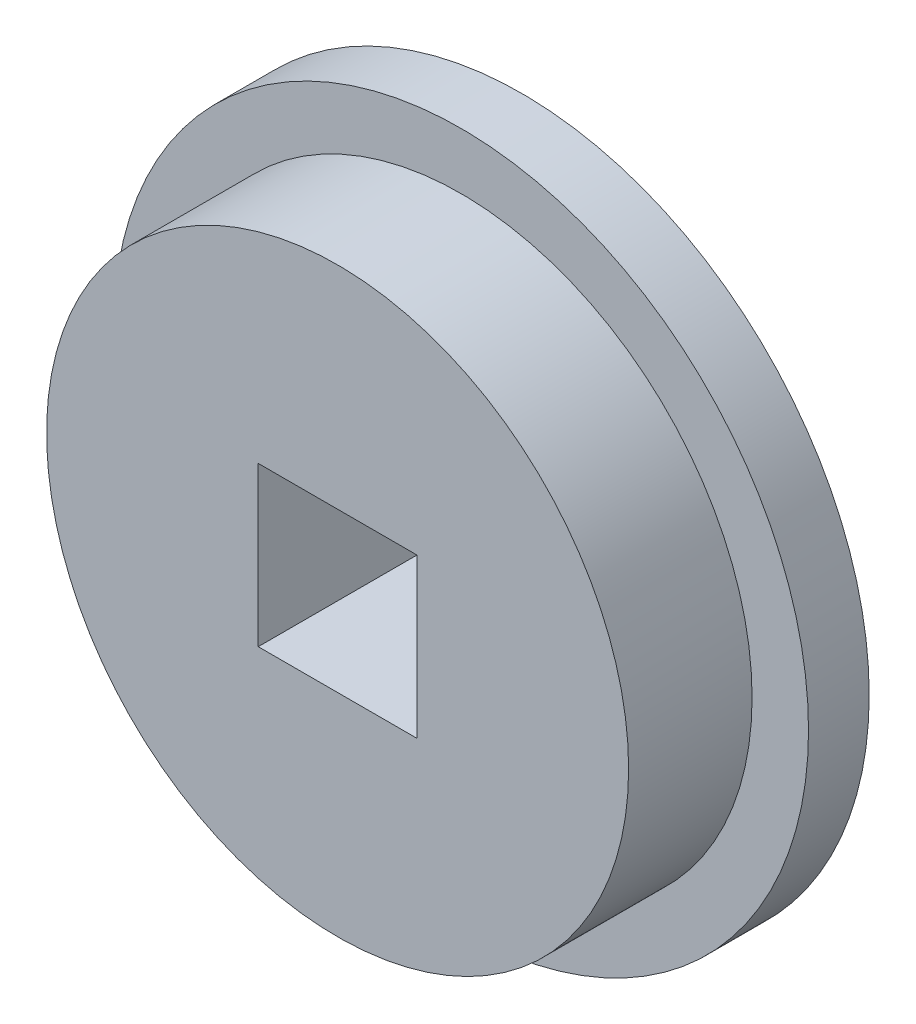
ISO-10303-21;
HEADER;
FILE_DESCRIPTION(('STEP AP214'),'2;1');
FILE_NAME('part.step','',(''),(''),'','','');
FILE_SCHEMA(('AUTOMOTIVE_DESIGN { 1 0 10303 214 1 1 1 1 }'));
ENDSEC;
DATA;
#1=APPLICATION_CONTEXT('core data for automotive mechanical design processes');
#2=APPLICATION_PROTOCOL_DEFINITION('international standard','automotive_design',2000,#1);
#3=PRODUCT_CONTEXT('',#1,'mechanical');
#4=PRODUCT('Part','Part','',(#3));
#5=PRODUCT_RELATED_PRODUCT_CATEGORY('part','',(#4));
#6=PRODUCT_DEFINITION_FORMATION('','',#4);
#7=PRODUCT_DEFINITION_CONTEXT('part definition',#1,'design');
#8=PRODUCT_DEFINITION('design','',#6,#7);
#9=PRODUCT_DEFINITION_SHAPE('','',#8);
#10=(LENGTH_UNIT() NAMED_UNIT(*) SI_UNIT(.MILLI.,.METRE.));
#11=(NAMED_UNIT(*) PLANE_ANGLE_UNIT() SI_UNIT($,.RADIAN.));
#12=(NAMED_UNIT(*) SI_UNIT($,.STERADIAN.) SOLID_ANGLE_UNIT());
#13=UNCERTAINTY_MEASURE_WITH_UNIT(LENGTH_MEASURE(1.E-05),#10,'distance_accuracy_value','');
#14=(GEOMETRIC_REPRESENTATION_CONTEXT(3) GLOBAL_UNCERTAINTY_ASSIGNED_CONTEXT((#13)) GLOBAL_UNIT_ASSIGNED_CONTEXT((#10,
#11,#12)) REPRESENTATION_CONTEXT('',''));
#15=CARTESIAN_POINT('',(0.,0.,0.));
#16=DIRECTION('',(0.,0.,1.));
#17=DIRECTION('',(1.,0.,0.));
#18=AXIS2_PLACEMENT_3D('',#15,#16,#17);
#19=CARTESIAN_POINT('',(0.,0.,6.6294));
#20=DIRECTION('',(0.,0.,1.));
#21=DIRECTION('',(1.,0.,0.));
#22=AXIS2_PLACEMENT_3D('',#19,#20,#21);
#23=CYLINDRICAL_SURFACE('',#22,10.4775);
#24=CARTESIAN_POINT('',(0.,0.,2.1844));
#25=DIRECTION('',(0.,0.,1.));
#26=DIRECTION('',(1.,0.,0.));
#27=AXIS2_PLACEMENT_3D('',#24,#25,#26);
#28=CIRCLE('',#27,10.4775);
#29=CARTESIAN_POINT('',(10.4775,0.,2.1844));
#30=VERTEX_POINT('',#29);
#31=EDGE_CURVE('E20',#30,#30,#28,.F.);
#32=ORIENTED_EDGE('',*,*,#31,.F.);
#33=EDGE_LOOP('',(#32));
#34=FACE_BOUND('',#33,.T.);
#35=CARTESIAN_POINT('',(0.,0.,6.6294));
#36=DIRECTION('',(0.,0.,1.));
#37=DIRECTION('',(1.,0.,0.));
#38=AXIS2_PLACEMENT_3D('',#35,#36,#37);
#39=CIRCLE('',#38,10.4775);
#40=CARTESIAN_POINT('',(10.4775,0.,6.6294));
#41=VERTEX_POINT('',#40);
#42=EDGE_CURVE('E89',#41,#41,#39,.T.);
#43=ORIENTED_EDGE('',*,*,#42,.F.);
#44=EDGE_LOOP('',(#43));
#45=FACE_BOUND('',#44,.T.);
#46=ADVANCED_FACE('F17',(#34,#45),#23,.T.);
#47=CARTESIAN_POINT('',(0.,0.,2.1844));
#48=DIRECTION('',(0.,0.,1.));
#49=DIRECTION('',(1.,0.,0.));
#50=AXIS2_PLACEMENT_3D('',#47,#48,#49);
#51=PLANE('',#50);
#52=ORIENTED_EDGE('',*,*,#31,.T.);
#53=EDGE_LOOP('',(#52));
#54=FACE_BOUND('',#53,.T.);
#55=CARTESIAN_POINT('',(0.,0.,2.1844));
#56=DIRECTION('',(0.,0.,1.));
#57=DIRECTION('',(1.,0.,0.));
#58=AXIS2_PLACEMENT_3D('',#55,#56,#57);
#59=CIRCLE('',#58,12.5095);
#60=CARTESIAN_POINT('',(12.5095,0.,2.1844));
#61=VERTEX_POINT('',#60);
#62=EDGE_CURVE('E76',#61,#61,#59,.F.);
#63=ORIENTED_EDGE('',*,*,#62,.F.);
#64=EDGE_LOOP('',(#63));
#65=FACE_BOUND('',#64,.T.);
#66=ADVANCED_FACE('F95',(#54,#65),#51,.T.);
#67=CARTESIAN_POINT('',(0.,0.,6.6294));
#68=DIRECTION('',(0.,0.,1.));
#69=DIRECTION('',(1.,0.,0.));
#70=AXIS2_PLACEMENT_3D('',#67,#68,#69);
#71=PLANE('',#70);
#72=DIRECTION('',(1.,0.,0.));
#73=VECTOR('',#72,1.);
#74=CARTESIAN_POINT('',(2.8575,-2.8575,6.6294));
#75=LINE('',#74,#73);
#76=CARTESIAN_POINT('',(-2.8575,-2.8575,6.6294));
#77=VERTEX_POINT('',#76);
#78=CARTESIAN_POINT('',(2.8575,-2.8575,6.6294));
#79=VERTEX_POINT('',#78);
#80=EDGE_CURVE('E72',#77,#79,#75,.T.);
#81=ORIENTED_EDGE('',*,*,#80,.F.);
#82=DIRECTION('',(0.,1.,0.));
#83=VECTOR('',#82,1.);
#84=CARTESIAN_POINT('',(-2.8575,-2.8575,6.6294));
#85=LINE('',#84,#83);
#86=CARTESIAN_POINT('',(-2.8575,2.8575,6.6294));
#87=VERTEX_POINT('',#86);
#88=EDGE_CURVE('E67',#87,#77,#85,.F.);
#89=ORIENTED_EDGE('',*,*,#88,.F.);
#90=DIRECTION('',(1.,0.,0.));
#91=VECTOR('',#90,1.);
#92=CARTESIAN_POINT('',(-2.8575,2.8575,6.6294));
#93=LINE('',#92,#91);
#94=CARTESIAN_POINT('',(2.8575,2.8575,6.6294));
#95=VERTEX_POINT('',#94);
#96=EDGE_CURVE('E58',#95,#87,#93,.F.);
#97=ORIENTED_EDGE('',*,*,#96,.F.);
#98=DIRECTION('',(0.,1.,0.));
#99=VECTOR('',#98,1.);
#100=CARTESIAN_POINT('',(2.8575,2.8575,6.6294));
#101=LINE('',#100,#99);
#102=EDGE_CURVE('E53',#79,#95,#101,.T.);
#103=ORIENTED_EDGE('',*,*,#102,.F.);
#104=EDGE_LOOP('',(#81,#89,#97,#103));
#105=FACE_BOUND('',#104,.T.);
#106=ORIENTED_EDGE('',*,*,#42,.T.);
#107=EDGE_LOOP('',(#106));
#108=FACE_BOUND('',#107,.T.);
#109=ADVANCED_FACE('F70',(#105,#108),#71,.T.);
#110=CARTESIAN_POINT('',(0.,0.,0.));
#111=DIRECTION('',(0.,0.,1.));
#112=DIRECTION('',(1.,0.,0.));
#113=AXIS2_PLACEMENT_3D('',#110,#111,#112);
#114=CYLINDRICAL_SURFACE('',#113,12.5095);
#115=CARTESIAN_POINT('',(0.,0.,0.));
#116=DIRECTION('',(0.,0.,1.));
#117=DIRECTION('',(1.,0.,0.));
#118=AXIS2_PLACEMENT_3D('',#115,#116,#117);
#119=CIRCLE('',#118,12.5095);
#120=CARTESIAN_POINT('',(12.5095,0.,0.));
#121=VERTEX_POINT('',#120);
#122=EDGE_CURVE('E85',#121,#121,#119,.T.);
#123=ORIENTED_EDGE('',*,*,#122,.T.);
#124=EDGE_LOOP('',(#123));
#125=FACE_BOUND('',#124,.T.);
#126=ORIENTED_EDGE('',*,*,#62,.T.);
#127=EDGE_LOOP('',(#126));
#128=FACE_BOUND('',#127,.T.);
#129=ADVANCED_FACE('F123',(#125,#128),#114,.T.);
#130=CARTESIAN_POINT('',(-2.8575,-2.8575,0.));
#131=DIRECTION('',(1.,0.,0.));
#132=DIRECTION('',(0.,0.,-1.));
#133=AXIS2_PLACEMENT_3D('',#130,#131,#132);
#134=PLANE('',#133);
#135=DIRECTION('',(0.,0.,1.));
#136=VECTOR('',#135,1.);
#137=CARTESIAN_POINT('',(-2.8575,-2.8575,0.));
#138=LINE('',#137,#136);
#139=CARTESIAN_POINT('',(-2.8575,-2.8575,0.));
#140=VERTEX_POINT('',#139);
#141=EDGE_CURVE('E203',#140,#77,#138,.T.);
#142=ORIENTED_EDGE('',*,*,#141,.F.);
#143=DIRECTION('',(0.,1.,0.));
#144=VECTOR('',#143,1.);
#145=CARTESIAN_POINT('',(-2.8575,0.,0.));
#146=LINE('',#145,#144);
#147=CARTESIAN_POINT('',(-2.8575,2.8575,0.));
#148=VERTEX_POINT('',#147);
#149=EDGE_CURVE('E80',#140,#148,#146,.T.);
#150=ORIENTED_EDGE('',*,*,#149,.T.);
#151=DIRECTION('',(0.,0.,-1.));
#152=VECTOR('',#151,1.);
#153=CARTESIAN_POINT('',(-2.8575,2.8575,0.));
#154=LINE('',#153,#152);
#155=EDGE_CURVE('E63',#87,#148,#154,.T.);
#156=ORIENTED_EDGE('',*,*,#155,.F.);
#157=ORIENTED_EDGE('',*,*,#88,.T.);
#158=EDGE_LOOP('',(#142,#150,#156,#157));
#159=FACE_BOUND('',#158,.T.);
#160=ADVANCED_FACE('F79',(#159),#134,.T.);
#161=CARTESIAN_POINT('',(-2.8575,2.8575,0.));
#162=DIRECTION('',(0.,-1.,0.));
#163=DIRECTION('',(0.,0.,-1.));
#164=AXIS2_PLACEMENT_3D('',#161,#162,#163);
#165=PLANE('',#164);
#166=ORIENTED_EDGE('',*,*,#155,.T.);
#167=DIRECTION('',(1.,0.,0.));
#168=VECTOR('',#167,1.);
#169=CARTESIAN_POINT('',(0.,2.8575,0.));
#170=LINE('',#169,#168);
#171=CARTESIAN_POINT('',(2.8575,2.8575,0.));
#172=VERTEX_POINT('',#171);
#173=EDGE_CURVE('E204',#148,#172,#170,.T.);
#174=ORIENTED_EDGE('',*,*,#173,.T.);
#175=DIRECTION('',(0.,0.,1.));
#176=VECTOR('',#175,1.);
#177=CARTESIAN_POINT('',(2.8575,2.8575,0.));
#178=LINE('',#177,#176);
#179=EDGE_CURVE('E65',#95,#172,#178,.F.);
#180=ORIENTED_EDGE('',*,*,#179,.F.);
#181=ORIENTED_EDGE('',*,*,#96,.T.);
#182=EDGE_LOOP('',(#166,#174,#180,#181));
#183=FACE_BOUND('',#182,.T.);
#184=ADVANCED_FACE('F60',(#183),#165,.T.);
#185=CARTESIAN_POINT('',(2.8575,2.8575,0.));
#186=DIRECTION('',(-1.,0.,0.));
#187=DIRECTION('',(0.,0.,1.));
#188=AXIS2_PLACEMENT_3D('',#185,#186,#187);
#189=PLANE('',#188);
#190=ORIENTED_EDGE('',*,*,#179,.T.);
#191=DIRECTION('',(0.,1.,0.));
#192=VECTOR('',#191,1.);
#193=CARTESIAN_POINT('',(2.8575,0.,0.));
#194=LINE('',#193,#192);
#195=CARTESIAN_POINT('',(2.8575,-2.8575,0.));
#196=VERTEX_POINT('',#195);
#197=EDGE_CURVE('E26',#172,#196,#194,.F.);
#198=ORIENTED_EDGE('',*,*,#197,.T.);
#199=DIRECTION('',(0.,0.,1.));
#200=VECTOR('',#199,1.);
#201=CARTESIAN_POINT('',(2.8575,-2.8575,0.));
#202=LINE('',#201,#200);
#203=EDGE_CURVE('E34',#79,#196,#202,.F.);
#204=ORIENTED_EDGE('',*,*,#203,.F.);
#205=ORIENTED_EDGE('',*,*,#102,.T.);
#206=EDGE_LOOP('',(#190,#198,#204,#205));
#207=FACE_BOUND('',#206,.T.);
#208=ADVANCED_FACE('F112',(#207),#189,.T.);
#209=CARTESIAN_POINT('',(2.8575,-2.8575,0.));
#210=DIRECTION('',(0.,1.,0.));
#211=DIRECTION('',(0.,0.,1.));
#212=AXIS2_PLACEMENT_3D('',#209,#210,#211);
#213=PLANE('',#212);
#214=ORIENTED_EDGE('',*,*,#203,.T.);
#215=DIRECTION('',(1.,0.,0.));
#216=VECTOR('',#215,1.);
#217=CARTESIAN_POINT('',(0.,-2.8575,0.));
#218=LINE('',#217,#216);
#219=EDGE_CURVE('E11',#196,#140,#218,.F.);
#220=ORIENTED_EDGE('',*,*,#219,.T.);
#221=ORIENTED_EDGE('',*,*,#141,.T.);
#222=ORIENTED_EDGE('',*,*,#80,.T.);
#223=EDGE_LOOP('',(#214,#220,#221,#222));
#224=FACE_BOUND('',#223,.T.);
#225=ADVANCED_FACE('F106',(#224),#213,.T.);
#226=CARTESIAN_POINT('',(0.,0.,0.));
#227=DIRECTION('',(0.,0.,1.));
#228=DIRECTION('',(1.,0.,0.));
#229=AXIS2_PLACEMENT_3D('',#226,#227,#228);
#230=PLANE('',#229);
#231=ORIENTED_EDGE('',*,*,#197,.F.);
#232=ORIENTED_EDGE('',*,*,#173,.F.);
#233=ORIENTED_EDGE('',*,*,#149,.F.);
#234=ORIENTED_EDGE('',*,*,#219,.F.);
#235=EDGE_LOOP('',(#231,#232,#233,#234));
#236=FACE_BOUND('',#235,.T.);
#237=ORIENTED_EDGE('',*,*,#122,.F.);
#238=EDGE_LOOP('',(#237));
#239=FACE_BOUND('',#238,.T.);
#240=ADVANCED_FACE('F104',(#236,#239),#230,.F.);
#241=CLOSED_SHELL('',(#46,#66,#109,#129,#160,#184,#208,#225,#240));
#242=MANIFOLD_SOLID_BREP('B1',#241);
#243=ADVANCED_BREP_SHAPE_REPRESENTATION('',(#18,#242),#14);
#244=SHAPE_DEFINITION_REPRESENTATION(#9,#243);
ENDSEC;
END-ISO-10303-21;
